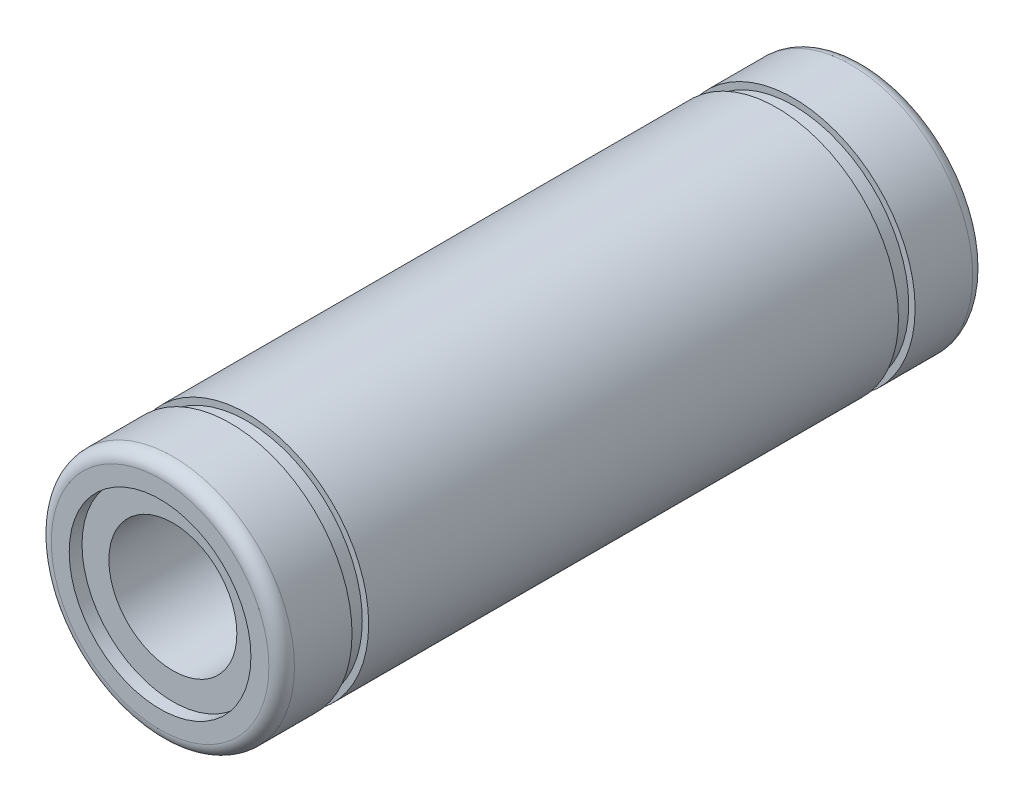
ISO-10303-21;
HEADER;
FILE_DESCRIPTION(('STEP AP214'),'2;1');
FILE_NAME('part.step','',(''),(''),'','','');
FILE_SCHEMA(('AUTOMOTIVE_DESIGN { 1 0 10303 214 1 1 1 1 }'));
ENDSEC;
DATA;
#1=APPLICATION_CONTEXT('core data for automotive mechanical design processes');
#2=APPLICATION_PROTOCOL_DEFINITION('international standard','automotive_design',2000,#1);
#3=PRODUCT_CONTEXT('',#1,'mechanical');
#4=PRODUCT('Part','Part','',(#3));
#5=PRODUCT_RELATED_PRODUCT_CATEGORY('part','',(#4));
#6=PRODUCT_DEFINITION_FORMATION('','',#4);
#7=PRODUCT_DEFINITION_CONTEXT('part definition',#1,'design');
#8=PRODUCT_DEFINITION('design','',#6,#7);
#9=PRODUCT_DEFINITION_SHAPE('','',#8);
#10=(LENGTH_UNIT() NAMED_UNIT(*) SI_UNIT(.MILLI.,.METRE.));
#11=(NAMED_UNIT(*) PLANE_ANGLE_UNIT() SI_UNIT($,.RADIAN.));
#12=(NAMED_UNIT(*) SI_UNIT($,.STERADIAN.) SOLID_ANGLE_UNIT());
#13=UNCERTAINTY_MEASURE_WITH_UNIT(LENGTH_MEASURE(1.E-05),#10,'distance_accuracy_value','');
#14=(GEOMETRIC_REPRESENTATION_CONTEXT(3) GLOBAL_UNCERTAINTY_ASSIGNED_CONTEXT((#13)) GLOBAL_UNIT_ASSIGNED_CONTEXT((#10,
#11,#12)) REPRESENTATION_CONTEXT('',''));
#15=CARTESIAN_POINT('',(0.,0.,0.));
#16=DIRECTION('',(0.,0.,1.));
#17=DIRECTION('',(1.,0.,0.));
#18=AXIS2_PLACEMENT_3D('',#15,#16,#17);
#19=CARTESIAN_POINT('',(0.,0.,55.));
#20=DIRECTION('',(0.,0.,-1.));
#21=DIRECTION('',(-1.,0.,0.));
#22=AXIS2_PLACEMENT_3D('',#19,#20,#21);
#23=CYLINDRICAL_SURFACE('',#22,9.5);
#24=CARTESIAN_POINT('',(0.,0.,6.80000000000001));
#25=DIRECTION('',(0.,0.,-1.));
#26=DIRECTION('',(-1.,0.,0.));
#27=AXIS2_PLACEMENT_3D('',#24,#25,#26);
#28=CIRCLE('',#27,9.5);
#29=CARTESIAN_POINT('',(-9.5,0.,6.80000000000001));
#30=VERTEX_POINT('',#29);
#31=EDGE_CURVE('E82',#30,#30,#28,.T.);
#32=ORIENTED_EDGE('',*,*,#31,.F.);
#33=EDGE_LOOP('',(#32));
#34=FACE_BOUND('',#33,.T.);
#35=CARTESIAN_POINT('',(0.,0.,48.2));
#36=DIRECTION('',(0.,0.,-1.));
#37=DIRECTION('',(-1.,0.,0.));
#38=AXIS2_PLACEMENT_3D('',#35,#36,#37);
#39=CIRCLE('',#38,9.5);
#40=CARTESIAN_POINT('',(-9.5,0.,48.2));
#41=VERTEX_POINT('',#40);
#42=EDGE_CURVE('E68',#41,#41,#39,.T.);
#43=ORIENTED_EDGE('',*,*,#42,.T.);
#44=EDGE_LOOP('',(#43));
#45=FACE_BOUND('',#44,.T.);
#46=ADVANCED_FACE('F32',(#34,#45),#23,.T.);
#47=CARTESIAN_POINT('',(0.,0.,1.));
#48=DIRECTION('',(0.,0.,1.));
#49=DIRECTION('',(1.,0.,0.));
#50=AXIS2_PLACEMENT_3D('',#47,#48,#49);
#51=CIRCLE('',#50,9.5);
#52=CARTESIAN_POINT('',(9.5,0.,1.));
#53=VERTEX_POINT('',#52);
#54=EDGE_CURVE('E39',#53,#53,#51,.T.);
#55=ORIENTED_EDGE('',*,*,#54,.T.);
#56=EDGE_LOOP('',(#55));
#57=FACE_BOUND('',#56,.T.);
#58=CARTESIAN_POINT('',(0.,0.,5.5));
#59=DIRECTION('',(0.,0.,-1.));
#60=DIRECTION('',(-1.,0.,0.));
#61=AXIS2_PLACEMENT_3D('',#58,#59,#60);
#62=CIRCLE('',#61,9.5);
#63=CARTESIAN_POINT('',(-9.5,0.,5.5));
#64=VERTEX_POINT('',#63);
#65=EDGE_CURVE('E91',#64,#64,#62,.T.);
#66=ORIENTED_EDGE('',*,*,#65,.T.);
#67=EDGE_LOOP('',(#66));
#68=FACE_BOUND('',#67,.T.);
#69=ADVANCED_FACE('F95',(#57,#68),#23,.T.);
#70=CARTESIAN_POINT('',(0.,0.,55.));
#71=DIRECTION('',(0.,0.,-1.));
#72=DIRECTION('',(-1.,0.,0.));
#73=AXIS2_PLACEMENT_3D('',#70,#71,#72);
#74=CYLINDRICAL_SURFACE('',#73,5.);
#75=CARTESIAN_POINT('',(0.,0.,54.));
#76=DIRECTION('',(0.,0.,1.));
#77=DIRECTION('',(1.,0.,0.));
#78=AXIS2_PLACEMENT_3D('',#75,#76,#77);
#79=CIRCLE('',#78,5.);
#80=CARTESIAN_POINT('',(5.,0.,54.));
#81=VERTEX_POINT('',#80);
#82=EDGE_CURVE('E52',#81,#81,#79,.T.);
#83=ORIENTED_EDGE('',*,*,#82,.T.);
#84=EDGE_LOOP('',(#83));
#85=FACE_BOUND('',#84,.T.);
#86=CARTESIAN_POINT('',(0.,0.,1.));
#87=DIRECTION('',(0.,0.,-1.));
#88=DIRECTION('',(-1.,0.,0.));
#89=AXIS2_PLACEMENT_3D('',#86,#87,#88);
#90=CIRCLE('',#89,5.);
#91=CARTESIAN_POINT('',(-5.,0.,1.));
#92=VERTEX_POINT('',#91);
#93=EDGE_CURVE('E53',#92,#92,#90,.T.);
#94=ORIENTED_EDGE('',*,*,#93,.T.);
#95=EDGE_LOOP('',(#94));
#96=FACE_BOUND('',#95,.T.);
#97=ADVANCED_FACE('F155',(#85,#96),#74,.F.);
#98=CARTESIAN_POINT('',(0.,0.,55.));
#99=DIRECTION('',(0.,0.,1.));
#100=DIRECTION('',(1.,0.,0.));
#101=AXIS2_PLACEMENT_3D('',#98,#99,#100);
#102=PLANE('',#101);
#103=CARTESIAN_POINT('',(0.,0.,55.));
#104=DIRECTION('',(0.,0.,1.));
#105=DIRECTION('',(1.,0.,0.));
#106=AXIS2_PLACEMENT_3D('',#103,#104,#105);
#107=CIRCLE('',#106,8.5);
#108=CARTESIAN_POINT('',(8.5,0.,55.));
#109=VERTEX_POINT('',#108);
#110=EDGE_CURVE('E47',#109,#109,#107,.T.);
#111=ORIENTED_EDGE('',*,*,#110,.T.);
#112=EDGE_LOOP('',(#111));
#113=FACE_BOUND('',#112,.T.);
#114=CARTESIAN_POINT('',(0.,0.,55.));
#115=DIRECTION('',(0.,0.,1.));
#116=DIRECTION('',(1.,0.,0.));
#117=AXIS2_PLACEMENT_3D('',#114,#115,#116);
#118=CIRCLE('',#117,7.1);
#119=CARTESIAN_POINT('',(7.1,0.,55.));
#120=VERTEX_POINT('',#119);
#121=EDGE_CURVE('E56',#120,#120,#118,.T.);
#122=ORIENTED_EDGE('',*,*,#121,.F.);
#123=EDGE_LOOP('',(#122));
#124=FACE_BOUND('',#123,.T.);
#125=ADVANCED_FACE('F152',(#113,#124),#102,.T.);
#126=CARTESIAN_POINT('',(0.,0.,0.));
#127=DIRECTION('',(0.,0.,1.));
#128=DIRECTION('',(1.,0.,0.));
#129=AXIS2_PLACEMENT_3D('',#126,#127,#128);
#130=PLANE('',#129);
#131=CARTESIAN_POINT('',(0.,0.,0.));
#132=DIRECTION('',(0.,0.,1.));
#133=DIRECTION('',(1.,0.,0.));
#134=AXIS2_PLACEMENT_3D('',#131,#132,#133);
#135=CIRCLE('',#134,8.5);
#136=CARTESIAN_POINT('',(8.5,0.,0.));
#137=VERTEX_POINT('',#136);
#138=EDGE_CURVE('E10',#137,#137,#135,.F.);
#139=ORIENTED_EDGE('',*,*,#138,.T.);
#140=EDGE_LOOP('',(#139));
#141=FACE_BOUND('',#140,.T.);
#142=CARTESIAN_POINT('',(0.,0.,0.));
#143=DIRECTION('',(0.,0.,-1.));
#144=DIRECTION('',(-1.,0.,0.));
#145=AXIS2_PLACEMENT_3D('',#142,#143,#144);
#146=CIRCLE('',#145,7.1);
#147=CARTESIAN_POINT('',(-7.1,0.,0.));
#148=VERTEX_POINT('',#147);
#149=EDGE_CURVE('E65',#148,#148,#146,.T.);
#150=ORIENTED_EDGE('',*,*,#149,.F.);
#151=EDGE_LOOP('',(#150));
#152=FACE_BOUND('',#151,.T.);
#153=ADVANCED_FACE('F143',(#141,#152),#130,.F.);
#154=CARTESIAN_POINT('',(0.,0.,54.));
#155=DIRECTION('',(0.,0.,1.));
#156=DIRECTION('',(1.,0.,0.));
#157=AXIS2_PLACEMENT_3D('',#154,#155,#156);
#158=CIRCLE('',#157,9.5);
#159=CARTESIAN_POINT('',(9.5,0.,54.));
#160=VERTEX_POINT('',#159);
#161=EDGE_CURVE('E43',#160,#160,#158,.F.);
#162=ORIENTED_EDGE('',*,*,#161,.T.);
#163=EDGE_LOOP('',(#162));
#164=FACE_BOUND('',#163,.T.);
#165=CARTESIAN_POINT('',(0.,0.,49.5));
#166=DIRECTION('',(0.,0.,-1.));
#167=DIRECTION('',(-1.,0.,0.));
#168=AXIS2_PLACEMENT_3D('',#165,#166,#167);
#169=CIRCLE('',#168,9.5);
#170=CARTESIAN_POINT('',(-9.5,0.,49.5));
#171=VERTEX_POINT('',#170);
#172=EDGE_CURVE('E79',#171,#171,#169,.T.);
#173=ORIENTED_EDGE('',*,*,#172,.F.);
#174=EDGE_LOOP('',(#173));
#175=FACE_BOUND('',#174,.T.);
#176=ADVANCED_FACE('F120',(#164,#175),#23,.T.);
#177=CARTESIAN_POINT('',(0.,0.,54.));
#178=DIRECTION('',(0.,0.,1.));
#179=DIRECTION('',(1.,0.,0.));
#180=AXIS2_PLACEMENT_3D('',#177,#178,#179);
#181=CYLINDRICAL_SURFACE('',#180,7.1);
#182=CARTESIAN_POINT('',(0.,0.,54.));
#183=DIRECTION('',(0.,0.,1.));
#184=DIRECTION('',(1.,0.,0.));
#185=AXIS2_PLACEMENT_3D('',#182,#183,#184);
#186=CIRCLE('',#185,7.1);
#187=CARTESIAN_POINT('',(7.1,0.,54.));
#188=VERTEX_POINT('',#187);
#189=EDGE_CURVE('E60',#188,#188,#186,.T.);
#190=ORIENTED_EDGE('',*,*,#189,.F.);
#191=EDGE_LOOP('',(#190));
#192=FACE_BOUND('',#191,.T.);
#193=ORIENTED_EDGE('',*,*,#121,.T.);
#194=EDGE_LOOP('',(#193));
#195=FACE_BOUND('',#194,.T.);
#196=ADVANCED_FACE('F142',(#192,#195),#181,.F.);
#197=CARTESIAN_POINT('',(0.,0.,54.));
#198=DIRECTION('',(0.,0.,1.));
#199=DIRECTION('',(1.,0.,0.));
#200=AXIS2_PLACEMENT_3D('',#197,#198,#199);
#201=PLANE('',#200);
#202=ORIENTED_EDGE('',*,*,#82,.F.);
#203=EDGE_LOOP('',(#202));
#204=FACE_BOUND('',#203,.T.);
#205=ORIENTED_EDGE('',*,*,#189,.T.);
#206=EDGE_LOOP('',(#205));
#207=FACE_BOUND('',#206,.T.);
#208=ADVANCED_FACE('F149',(#204,#207),#201,.T.);
#209=CARTESIAN_POINT('',(0.,0.,1.));
#210=DIRECTION('',(0.,0.,-1.));
#211=DIRECTION('',(-1.,0.,0.));
#212=AXIS2_PLACEMENT_3D('',#209,#210,#211);
#213=CYLINDRICAL_SURFACE('',#212,7.1);
#214=CARTESIAN_POINT('',(0.,0.,1.));
#215=DIRECTION('',(0.,0.,-1.));
#216=DIRECTION('',(-1.,0.,0.));
#217=AXIS2_PLACEMENT_3D('',#214,#215,#216);
#218=CIRCLE('',#217,7.1);
#219=CARTESIAN_POINT('',(-7.1,0.,1.));
#220=VERTEX_POINT('',#219);
#221=EDGE_CURVE('E57',#220,#220,#218,.T.);
#222=ORIENTED_EDGE('',*,*,#221,.F.);
#223=EDGE_LOOP('',(#222));
#224=FACE_BOUND('',#223,.T.);
#225=ORIENTED_EDGE('',*,*,#149,.T.);
#226=EDGE_LOOP('',(#225));
#227=FACE_BOUND('',#226,.T.);
#228=ADVANCED_FACE('F170',(#224,#227),#213,.F.);
#229=CARTESIAN_POINT('',(0.,0.,1.));
#230=DIRECTION('',(0.,0.,-1.));
#231=DIRECTION('',(-1.,0.,0.));
#232=AXIS2_PLACEMENT_3D('',#229,#230,#231);
#233=PLANE('',#232);
#234=ORIENTED_EDGE('',*,*,#93,.F.);
#235=EDGE_LOOP('',(#234));
#236=FACE_BOUND('',#235,.T.);
#237=ORIENTED_EDGE('',*,*,#221,.T.);
#238=EDGE_LOOP('',(#237));
#239=FACE_BOUND('',#238,.T.);
#240=ADVANCED_FACE('F127',(#236,#239),#233,.T.);
#241=CARTESIAN_POINT('',(-9.5,0.,48.2));
#242=DIRECTION('',(0.,0.,-1.));
#243=DIRECTION('',(-1.,0.,0.));
#244=AXIS2_PLACEMENT_3D('',#241,#242,#243);
#245=PLANE('',#244);
#246=ORIENTED_EDGE('',*,*,#42,.F.);
#247=EDGE_LOOP('',(#246));
#248=FACE_BOUND('',#247,.T.);
#249=CARTESIAN_POINT('',(0.,0.,48.2));
#250=DIRECTION('',(0.,0.,-1.));
#251=DIRECTION('',(-1.,0.,0.));
#252=AXIS2_PLACEMENT_3D('',#249,#250,#251);
#253=CIRCLE('',#252,8.99999999999999);
#254=CARTESIAN_POINT('',(-8.99999999999999,0.,48.2));
#255=VERTEX_POINT('',#254);
#256=EDGE_CURVE('E73',#255,#255,#253,.T.);
#257=ORIENTED_EDGE('',*,*,#256,.T.);
#258=EDGE_LOOP('',(#257));
#259=FACE_BOUND('',#258,.T.);
#260=ADVANCED_FACE('F123',(#248,#259),#245,.F.);
#261=CARTESIAN_POINT('',(0.,0.,0.));
#262=DIRECTION('',(0.,0.,-1.));
#263=DIRECTION('',(-1.,0.,0.));
#264=AXIS2_PLACEMENT_3D('',#261,#262,#263);
#265=CYLINDRICAL_SURFACE('',#264,8.99999999999999);
#266=ORIENTED_EDGE('',*,*,#256,.F.);
#267=EDGE_LOOP('',(#266));
#268=FACE_BOUND('',#267,.T.);
#269=CARTESIAN_POINT('',(0.,0.,49.5));
#270=DIRECTION('',(0.,0.,-1.));
#271=DIRECTION('',(-1.,0.,0.));
#272=AXIS2_PLACEMENT_3D('',#269,#270,#271);
#273=CIRCLE('',#272,8.99999999999999);
#274=CARTESIAN_POINT('',(-8.99999999999999,0.,49.5));
#275=VERTEX_POINT('',#274);
#276=EDGE_CURVE('E76',#275,#275,#273,.T.);
#277=ORIENTED_EDGE('',*,*,#276,.T.);
#278=EDGE_LOOP('',(#277));
#279=FACE_BOUND('',#278,.T.);
#280=ADVANCED_FACE('F126',(#268,#279),#265,.T.);
#281=CARTESIAN_POINT('',(-9.5,0.,49.5));
#282=DIRECTION('',(0.,0.,1.));
#283=DIRECTION('',(1.,0.,0.));
#284=AXIS2_PLACEMENT_3D('',#281,#282,#283);
#285=PLANE('',#284);
#286=ORIENTED_EDGE('',*,*,#276,.F.);
#287=EDGE_LOOP('',(#286));
#288=FACE_BOUND('',#287,.T.);
#289=ORIENTED_EDGE('',*,*,#172,.T.);
#290=EDGE_LOOP('',(#289));
#291=FACE_BOUND('',#290,.T.);
#292=ADVANCED_FACE('F113',(#288,#291),#285,.F.);
#293=CARTESIAN_POINT('',(-9.5,0.,6.80000000000001));
#294=DIRECTION('',(0.,0.,1.));
#295=DIRECTION('',(1.,0.,0.));
#296=AXIS2_PLACEMENT_3D('',#293,#294,#295);
#297=PLANE('',#296);
#298=CARTESIAN_POINT('',(0.,0.,6.80000000000001));
#299=DIRECTION('',(0.,0.,-1.));
#300=DIRECTION('',(-1.,0.,0.));
#301=AXIS2_PLACEMENT_3D('',#298,#299,#300);
#302=CIRCLE('',#301,8.99999999999999);
#303=CARTESIAN_POINT('',(-8.99999999999999,0.,6.80000000000001));
#304=VERTEX_POINT('',#303);
#305=EDGE_CURVE('E85',#304,#304,#302,.T.);
#306=ORIENTED_EDGE('',*,*,#305,.F.);
#307=EDGE_LOOP('',(#306));
#308=FACE_BOUND('',#307,.T.);
#309=ORIENTED_EDGE('',*,*,#31,.T.);
#310=EDGE_LOOP('',(#309));
#311=FACE_BOUND('',#310,.T.);
#312=ADVANCED_FACE('F107',(#308,#311),#297,.F.);
#313=CARTESIAN_POINT('',(0.,0.,0.));
#314=DIRECTION('',(0.,0.,-1.));
#315=DIRECTION('',(-1.,0.,0.));
#316=AXIS2_PLACEMENT_3D('',#313,#314,#315);
#317=CYLINDRICAL_SURFACE('',#316,9.);
#318=CARTESIAN_POINT('',(0.,0.,5.5));
#319=DIRECTION('',(0.,0.,-1.));
#320=DIRECTION('',(-1.,0.,0.));
#321=AXIS2_PLACEMENT_3D('',#318,#319,#320);
#322=CIRCLE('',#321,9.);
#323=CARTESIAN_POINT('',(-9.,0.,5.5));
#324=VERTEX_POINT('',#323);
#325=EDGE_CURVE('E88',#324,#324,#322,.T.);
#326=ORIENTED_EDGE('',*,*,#325,.F.);
#327=EDGE_LOOP('',(#326));
#328=FACE_BOUND('',#327,.T.);
#329=ORIENTED_EDGE('',*,*,#305,.T.);
#330=EDGE_LOOP('',(#329));
#331=FACE_BOUND('',#330,.T.);
#332=ADVANCED_FACE('F101',(#328,#331),#317,.T.);
#333=CARTESIAN_POINT('',(-9.5,0.,5.5));
#334=DIRECTION('',(0.,0.,-1.));
#335=DIRECTION('',(-1.,0.,0.));
#336=AXIS2_PLACEMENT_3D('',#333,#334,#335);
#337=PLANE('',#336);
#338=ORIENTED_EDGE('',*,*,#65,.F.);
#339=EDGE_LOOP('',(#338));
#340=FACE_BOUND('',#339,.T.);
#341=ORIENTED_EDGE('',*,*,#325,.T.);
#342=EDGE_LOOP('',(#341));
#343=FACE_BOUND('',#342,.T.);
#344=ADVANCED_FACE('F97',(#340,#343),#337,.F.);
#345=CARTESIAN_POINT('',(0.,0.,54.));
#346=DIRECTION('',(0.,0.,1.));
#347=DIRECTION('',(1.,0.,0.));
#348=AXIS2_PLACEMENT_3D('',#345,#346,#347);
#349=TOROIDAL_SURFACE('',#348,8.5,1.);
#350=ORIENTED_EDGE('',*,*,#161,.F.);
#351=EDGE_LOOP('',(#350));
#352=FACE_BOUND('',#351,.T.);
#353=ORIENTED_EDGE('',*,*,#110,.F.);
#354=EDGE_LOOP('',(#353));
#355=FACE_BOUND('',#354,.T.);
#356=ADVANCED_FACE('F100',(#352,#355),#349,.T.);
#357=CARTESIAN_POINT('',(0.,0.,1.));
#358=DIRECTION('',(0.,0.,1.));
#359=DIRECTION('',(1.,0.,0.));
#360=AXIS2_PLACEMENT_3D('',#357,#358,#359);
#361=TOROIDAL_SURFACE('',#360,8.5,1.);
#362=ORIENTED_EDGE('',*,*,#138,.F.);
#363=EDGE_LOOP('',(#362));
#364=FACE_BOUND('',#363,.T.);
#365=ORIENTED_EDGE('',*,*,#54,.F.);
#366=EDGE_LOOP('',(#365));
#367=FACE_BOUND('',#366,.T.);
#368=ADVANCED_FACE('F34',(#364,#367),#361,.T.);
#369=CLOSED_SHELL('',(#46,#69,#97,#125,#153,#176,#196,#208,#228,#240,#260,#280,#292,#312,#332,
#344,#356,#368));
#370=MANIFOLD_SOLID_BREP('B2',#369);
#371=ADVANCED_BREP_SHAPE_REPRESENTATION('',(#18,#370),#14);
#372=SHAPE_DEFINITION_REPRESENTATION(#9,#371);
ENDSEC;
END-ISO-10303-21;
